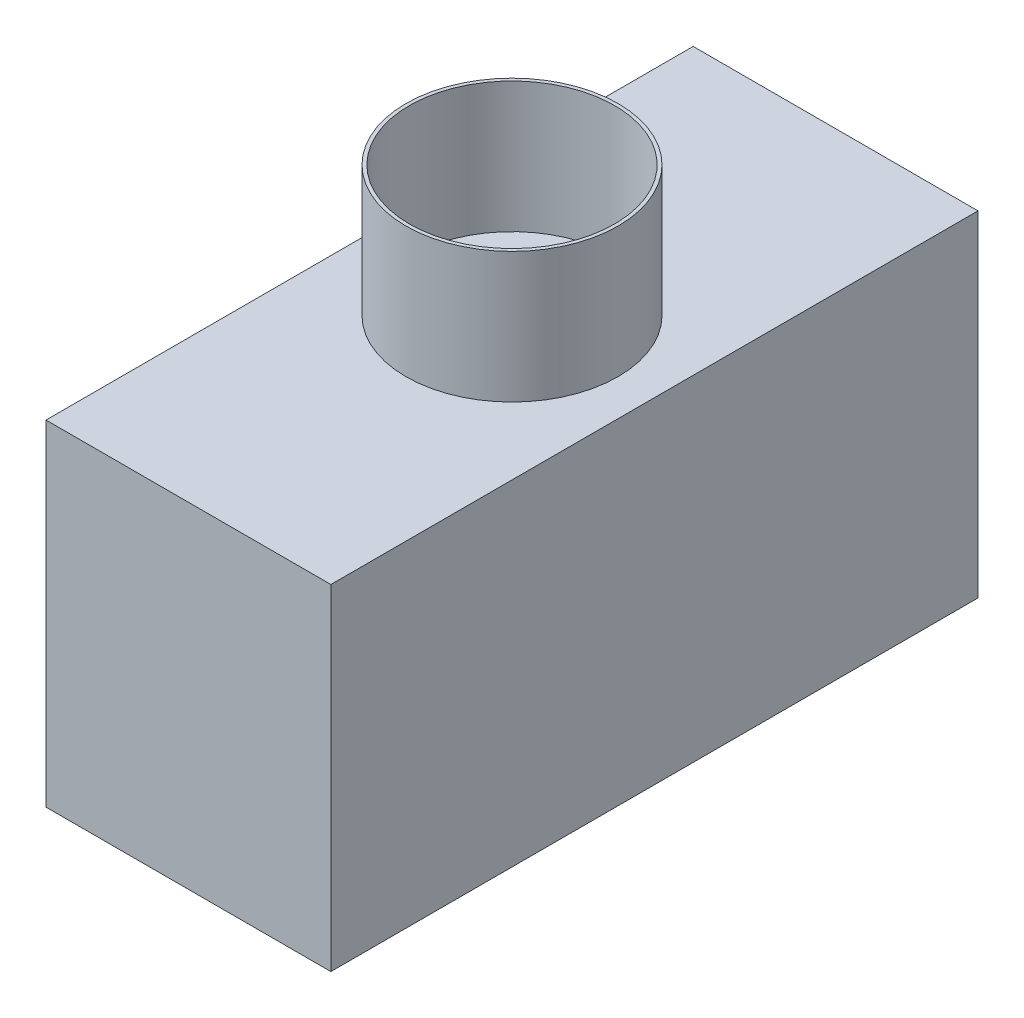
ISO-10303-21;
HEADER;
FILE_DESCRIPTION(('STEP AP214'),'2;1');
FILE_NAME('part.step','',(''),(''),'','','');
FILE_SCHEMA(('AUTOMOTIVE_DESIGN { 1 0 10303 214 1 1 1 1 }'));
ENDSEC;
DATA;
#1=APPLICATION_CONTEXT('core data for automotive mechanical design processes');
#2=APPLICATION_PROTOCOL_DEFINITION('international standard','automotive_design',2000,#1);
#3=PRODUCT_CONTEXT('',#1,'mechanical');
#4=PRODUCT('Part','Part','',(#3));
#5=PRODUCT_RELATED_PRODUCT_CATEGORY('part','',(#4));
#6=PRODUCT_DEFINITION_FORMATION('','',#4);
#7=PRODUCT_DEFINITION_CONTEXT('part definition',#1,'design');
#8=PRODUCT_DEFINITION('design','',#6,#7);
#9=PRODUCT_DEFINITION_SHAPE('','',#8);
#10=(LENGTH_UNIT() NAMED_UNIT(*) SI_UNIT(.MILLI.,.METRE.));
#11=(NAMED_UNIT(*) PLANE_ANGLE_UNIT() SI_UNIT($,.RADIAN.));
#12=(NAMED_UNIT(*) SI_UNIT($,.STERADIAN.) SOLID_ANGLE_UNIT());
#13=UNCERTAINTY_MEASURE_WITH_UNIT(LENGTH_MEASURE(1.E-05),#10,'distance_accuracy_value','');
#14=(GEOMETRIC_REPRESENTATION_CONTEXT(3) GLOBAL_UNCERTAINTY_ASSIGNED_CONTEXT((#13)) GLOBAL_UNIT_ASSIGNED_CONTEXT((#10,
#11,#12)) REPRESENTATION_CONTEXT('',''));
#15=CARTESIAN_POINT('',(0.,0.,0.));
#16=DIRECTION('',(0.,0.,1.));
#17=DIRECTION('',(1.,0.,0.));
#18=AXIS2_PLACEMENT_3D('',#15,#16,#17);
#19=CARTESIAN_POINT('',(0.,160.528,-309.88));
#20=DIRECTION('',(0.,-1.,0.));
#21=DIRECTION('',(0.,0.,-1.));
#22=AXIS2_PLACEMENT_3D('',#19,#20,#21);
#23=PLANE('',#22);
#24=DIRECTION('',(0.,0.,1.));
#25=VECTOR('',#24,1.);
#26=CARTESIAN_POINT('',(0.,160.528,0.));
#27=LINE('',#26,#25);
#28=CARTESIAN_POINT('',(0.,160.528,-309.88));
#29=VERTEX_POINT('',#28);
#30=CARTESIAN_POINT('',(0.,160.528,0.));
#31=VERTEX_POINT('',#30);
#32=EDGE_CURVE('E84',#29,#31,#27,.T.);
#33=ORIENTED_EDGE('',*,*,#32,.T.);
#34=DIRECTION('',(1.,0.,0.));
#35=VECTOR('',#34,1.);
#36=CARTESIAN_POINT('',(0.,160.528,0.));
#37=LINE('',#36,#35);
#38=CARTESIAN_POINT('',(136.398,160.528,0.));
#39=VERTEX_POINT('',#38);
#40=EDGE_CURVE('E79',#31,#39,#37,.T.);
#41=ORIENTED_EDGE('',*,*,#40,.T.);
#42=DIRECTION('',(0.,0.,-1.));
#43=VECTOR('',#42,1.);
#44=CARTESIAN_POINT('',(136.398,160.528,0.));
#45=LINE('',#44,#43);
#46=CARTESIAN_POINT('',(136.398,160.528,-309.88));
#47=VERTEX_POINT('',#46);
#48=EDGE_CURVE('E82',#39,#47,#45,.T.);
#49=ORIENTED_EDGE('',*,*,#48,.T.);
#50=DIRECTION('',(-1.,0.,0.));
#51=VECTOR('',#50,1.);
#52=CARTESIAN_POINT('',(0.,160.528,-309.88));
#53=LINE('',#52,#51);
#54=EDGE_CURVE('E48',#47,#29,#53,.T.);
#55=ORIENTED_EDGE('',*,*,#54,.T.);
#56=EDGE_LOOP('',(#33,#41,#49,#55));
#57=FACE_BOUND('',#56,.T.);
#58=CARTESIAN_POINT('',(68.199,160.528,-154.94));
#59=DIRECTION('',(0.,-1.,0.));
#60=DIRECTION('',(0.,0.,-1.));
#61=AXIS2_PLACEMENT_3D('',#58,#59,#60);
#62=CIRCLE('',#61,50.8);
#63=CARTESIAN_POINT('',(68.199,160.528,-205.74));
#64=VERTEX_POINT('',#63);
#65=EDGE_CURVE('E11',#64,#64,#62,.F.);
#66=ORIENTED_EDGE('',*,*,#65,.F.);
#67=EDGE_LOOP('',(#66));
#68=FACE_BOUND('',#67,.T.);
#69=ADVANCED_FACE('F30',(#57,#68),#23,.F.);
#70=CARTESIAN_POINT('',(0.,160.528,0.));
#71=DIRECTION('',(1.,0.,0.));
#72=DIRECTION('',(0.,0.,-1.));
#73=AXIS2_PLACEMENT_3D('',#70,#71,#72);
#74=PLANE('',#73);
#75=DIRECTION('',(0.,0.,1.));
#76=VECTOR('',#75,1.);
#77=CARTESIAN_POINT('',(0.,0.,0.));
#78=LINE('',#77,#76);
#79=CARTESIAN_POINT('',(0.,0.,-309.88));
#80=VERTEX_POINT('',#79);
#81=CARTESIAN_POINT('',(0.,0.,0.));
#82=VERTEX_POINT('',#81);
#83=EDGE_CURVE('E98',#80,#82,#78,.T.);
#84=ORIENTED_EDGE('',*,*,#83,.T.);
#85=DIRECTION('',(0.,-1.,0.));
#86=VECTOR('',#85,1.);
#87=CARTESIAN_POINT('',(0.,160.528,0.));
#88=LINE('',#87,#86);
#89=EDGE_CURVE('E40',#31,#82,#88,.T.);
#90=ORIENTED_EDGE('',*,*,#89,.F.);
#91=ORIENTED_EDGE('',*,*,#32,.F.);
#92=DIRECTION('',(0.,-1.,0.));
#93=VECTOR('',#92,1.);
#94=CARTESIAN_POINT('',(0.,160.528,-309.88));
#95=LINE('',#94,#93);
#96=EDGE_CURVE('E94',#29,#80,#95,.T.);
#97=ORIENTED_EDGE('',*,*,#96,.T.);
#98=EDGE_LOOP('',(#84,#90,#91,#97));
#99=FACE_BOUND('',#98,.T.);
#100=ADVANCED_FACE('F32',(#99),#74,.F.);
#101=CARTESIAN_POINT('',(0.,160.528,0.));
#102=DIRECTION('',(0.,0.,-1.));
#103=DIRECTION('',(-1.,0.,0.));
#104=AXIS2_PLACEMENT_3D('',#101,#102,#103);
#105=PLANE('',#104);
#106=DIRECTION('',(1.,0.,0.));
#107=VECTOR('',#106,1.);
#108=CARTESIAN_POINT('',(0.,0.,0.));
#109=LINE('',#108,#107);
#110=CARTESIAN_POINT('',(136.398,0.,0.));
#111=VERTEX_POINT('',#110);
#112=EDGE_CURVE('E89',#82,#111,#109,.T.);
#113=ORIENTED_EDGE('',*,*,#112,.T.);
#114=DIRECTION('',(0.,-1.,0.));
#115=VECTOR('',#114,1.);
#116=CARTESIAN_POINT('',(136.398,160.528,0.));
#117=LINE('',#116,#115);
#118=EDGE_CURVE('E87',#39,#111,#117,.T.);
#119=ORIENTED_EDGE('',*,*,#118,.F.);
#120=ORIENTED_EDGE('',*,*,#40,.F.);
#121=ORIENTED_EDGE('',*,*,#89,.T.);
#122=EDGE_LOOP('',(#113,#119,#120,#121));
#123=FACE_BOUND('',#122,.T.);
#124=ADVANCED_FACE('F88',(#123),#105,.F.);
#125=CARTESIAN_POINT('',(136.398,160.528,0.));
#126=DIRECTION('',(-1.,0.,0.));
#127=DIRECTION('',(0.,0.,1.));
#128=AXIS2_PLACEMENT_3D('',#125,#126,#127);
#129=PLANE('',#128);
#130=DIRECTION('',(0.,0.,-1.));
#131=VECTOR('',#130,1.);
#132=CARTESIAN_POINT('',(136.398,0.,0.));
#133=LINE('',#132,#131);
#134=CARTESIAN_POINT('',(136.398,0.,-309.88));
#135=VERTEX_POINT('',#134);
#136=EDGE_CURVE('E65',#111,#135,#133,.T.);
#137=ORIENTED_EDGE('',*,*,#136,.T.);
#138=DIRECTION('',(0.,-1.,0.));
#139=VECTOR('',#138,1.);
#140=CARTESIAN_POINT('',(136.398,160.528,-309.88));
#141=LINE('',#140,#139);
#142=EDGE_CURVE('E90',#47,#135,#141,.T.);
#143=ORIENTED_EDGE('',*,*,#142,.F.);
#144=ORIENTED_EDGE('',*,*,#48,.F.);
#145=ORIENTED_EDGE('',*,*,#118,.T.);
#146=EDGE_LOOP('',(#137,#143,#144,#145));
#147=FACE_BOUND('',#146,.T.);
#148=ADVANCED_FACE('F92',(#147),#129,.F.);
#149=CARTESIAN_POINT('',(0.,160.528,-309.88));
#150=DIRECTION('',(0.,0.,1.));
#151=DIRECTION('',(1.,0.,0.));
#152=AXIS2_PLACEMENT_3D('',#149,#150,#151);
#153=PLANE('',#152);
#154=DIRECTION('',(-1.,0.,0.));
#155=VECTOR('',#154,1.);
#156=CARTESIAN_POINT('',(0.,0.,-309.88));
#157=LINE('',#156,#155);
#158=EDGE_CURVE('E71',#135,#80,#157,.T.);
#159=ORIENTED_EDGE('',*,*,#158,.T.);
#160=ORIENTED_EDGE('',*,*,#96,.F.);
#161=ORIENTED_EDGE('',*,*,#54,.F.);
#162=ORIENTED_EDGE('',*,*,#142,.T.);
#163=EDGE_LOOP('',(#159,#160,#161,#162));
#164=FACE_BOUND('',#163,.T.);
#165=ADVANCED_FACE('F113',(#164),#153,.F.);
#166=CARTESIAN_POINT('',(0.,0.,-309.88));
#167=DIRECTION('',(0.,-1.,0.));
#168=DIRECTION('',(0.,0.,-1.));
#169=AXIS2_PLACEMENT_3D('',#166,#167,#168);
#170=PLANE('',#169);
#171=ORIENTED_EDGE('',*,*,#83,.F.);
#172=ORIENTED_EDGE('',*,*,#158,.F.);
#173=ORIENTED_EDGE('',*,*,#136,.F.);
#174=ORIENTED_EDGE('',*,*,#112,.F.);
#175=EDGE_LOOP('',(#171,#172,#173,#174));
#176=FACE_BOUND('',#175,.T.);
#177=ADVANCED_FACE('F110',(#176),#170,.T.);
#178=CARTESIAN_POINT('',(68.199,223.012,-154.94));
#179=DIRECTION('',(0.,-1.,0.));
#180=DIRECTION('',(0.,0.,-1.));
#181=AXIS2_PLACEMENT_3D('',#178,#179,#180);
#182=CYLINDRICAL_SURFACE('',#181,50.8);
#183=CARTESIAN_POINT('',(68.199,223.012,-154.94));
#184=DIRECTION('',(0.,1.,0.));
#185=DIRECTION('',(0.,0.,1.));
#186=AXIS2_PLACEMENT_3D('',#183,#184,#185);
#187=CIRCLE('',#186,50.8);
#188=CARTESIAN_POINT('',(68.199,223.012,-205.74));
#189=VERTEX_POINT('',#188);
#190=EDGE_CURVE('E101',#189,#189,#187,.T.);
#191=CARTESIAN_POINT('',(68.199,223.012,-205.74));
#192=CARTESIAN_POINT('',(68.199,222.361125,-205.74));
#193=CARTESIAN_POINT('',(68.199,221.71025,-205.74));
#194=CARTESIAN_POINT('',(68.199,220.4085,-205.74));
#195=CARTESIAN_POINT('',(68.199,219.757625,-205.74));
#196=CARTESIAN_POINT('',(68.199,218.455875,-205.74));
#197=CARTESIAN_POINT('',(68.199,217.805,-205.74));
#198=CARTESIAN_POINT('',(68.199,216.50325,-205.74));
#199=CARTESIAN_POINT('',(68.199,215.852375,-205.74));
#200=CARTESIAN_POINT('',(68.199,214.550625,-205.74));
#201=CARTESIAN_POINT('',(68.199,213.89975,-205.74));
#202=CARTESIAN_POINT('',(68.199,212.598,-205.74));
#203=CARTESIAN_POINT('',(68.199,211.947125,-205.74));
#204=CARTESIAN_POINT('',(68.199,210.645375,-205.74));
#205=CARTESIAN_POINT('',(68.199,209.9945,-205.74));
#206=CARTESIAN_POINT('',(68.199,208.69275,-205.74));
#207=CARTESIAN_POINT('',(68.199,208.041875,-205.74));
#208=CARTESIAN_POINT('',(68.199,206.740125,-205.74));
#209=CARTESIAN_POINT('',(68.199,206.08925,-205.74));
#210=CARTESIAN_POINT('',(68.199,204.7875,-205.74));
#211=CARTESIAN_POINT('',(68.199,204.136625,-205.74));
#212=CARTESIAN_POINT('',(68.199,202.834875,-205.74));
#213=CARTESIAN_POINT('',(68.199,202.184,-205.74));
#214=CARTESIAN_POINT('',(68.199,200.88225,-205.74));
#215=CARTESIAN_POINT('',(68.199,200.231375,-205.74));
#216=CARTESIAN_POINT('',(68.199,198.929625,-205.74));
#217=CARTESIAN_POINT('',(68.199,198.27875,-205.74));
#218=CARTESIAN_POINT('',(68.199,196.977,-205.74));
#219=CARTESIAN_POINT('',(68.199,196.326125,-205.74));
#220=CARTESIAN_POINT('',(68.199,195.024375,-205.74));
#221=CARTESIAN_POINT('',(68.199,194.3735,-205.74));
#222=CARTESIAN_POINT('',(68.199,193.07175,-205.74));
#223=CARTESIAN_POINT('',(68.199,192.420875,-205.74));
#224=CARTESIAN_POINT('',(68.199,191.119125,-205.74));
#225=CARTESIAN_POINT('',(68.199,190.46825,-205.74));
#226=CARTESIAN_POINT('',(68.199,189.1665,-205.74));
#227=CARTESIAN_POINT('',(68.199,188.515625,-205.74));
#228=CARTESIAN_POINT('',(68.199,187.213875,-205.74));
#229=CARTESIAN_POINT('',(68.199,186.563,-205.74));
#230=CARTESIAN_POINT('',(68.199,185.26125,-205.74));
#231=CARTESIAN_POINT('',(68.199,184.610375,-205.74));
#232=CARTESIAN_POINT('',(68.199,183.308625,-205.74));
#233=CARTESIAN_POINT('',(68.199,182.65775,-205.74));
#234=CARTESIAN_POINT('',(68.199,181.356,-205.74));
#235=CARTESIAN_POINT('',(68.199,180.705125,-205.74));
#236=CARTESIAN_POINT('',(68.199,179.403375,-205.74));
#237=CARTESIAN_POINT('',(68.199,178.7525,-205.74));
#238=CARTESIAN_POINT('',(68.199,177.45075,-205.74));
#239=CARTESIAN_POINT('',(68.199,176.799875,-205.74));
#240=CARTESIAN_POINT('',(68.199,175.498125,-205.74));
#241=CARTESIAN_POINT('',(68.199,174.84725,-205.74));
#242=CARTESIAN_POINT('',(68.199,173.5455,-205.74));
#243=CARTESIAN_POINT('',(68.199,172.894625,-205.74));
#244=CARTESIAN_POINT('',(68.199,171.592875,-205.74));
#245=CARTESIAN_POINT('',(68.199,170.942,-205.74));
#246=CARTESIAN_POINT('',(68.199,169.64025,-205.74));
#247=CARTESIAN_POINT('',(68.199,168.989375,-205.74));
#248=CARTESIAN_POINT('',(68.199,167.687625,-205.74));
#249=CARTESIAN_POINT('',(68.199,167.03675,-205.74));
#250=CARTESIAN_POINT('',(68.199,165.735,-205.74));
#251=CARTESIAN_POINT('',(68.199,165.084125,-205.74));
#252=CARTESIAN_POINT('',(68.199,163.782375,-205.74));
#253=CARTESIAN_POINT('',(68.199,163.1315,-205.74));
#254=CARTESIAN_POINT('',(68.199,161.82975,-205.74));
#255=CARTESIAN_POINT('',(68.199,161.178875,-205.74));
#256=CARTESIAN_POINT('',(68.199,160.528,-205.74));
#257=B_SPLINE_CURVE_WITH_KNOTS('',3,(#191,#192,#193,#194,#195,#196,#197,#198,#199,#200,#201,
#202,#203,#204,#205,#206,#207,#208,#209,#210,#211,#212,#213,#214,#215,#216,#217,#218,#219,#220,
#221,#222,#223,#224,#225,#226,#227,#228,#229,#230,#231,#232,#233,#234,#235,#236,#237,#238,#239,
#240,#241,#242,#243,#244,#245,#246,#247,#248,#249,#250,#251,#252,#253,#254,#255,#256),
.UNSPECIFIED.,.F.,.F.,(4,2,2,2,2,2,2,2,2,2,2,2,2,2,2,2,2,2,2,2,2,2,2,2,2,2,2,2,2,2,2,2,4),(0.,
1.95262499999999,3.90524999999997,5.85787499999998,7.81049999999997,9.76312499999998,11.71575,
13.668375,15.621,17.573625,19.52625,21.478875,23.4315,25.384125,27.33675,29.2893749999999,
31.242,33.194625,35.14725,37.0998749999999,39.0525,41.0051249999999,42.9577499999999,
44.9103749999999,46.863,48.8156249999999,50.7682499999999,52.7208749999999,54.6734999999999,
56.6261249999999,58.5787499999999,60.5313749999999,62.4839999999999),.UNSPECIFIED.);
#258=EDGE_CURVE('BSEAM112',#189,#64,#257,.T.);
#259=ORIENTED_EDGE('',*,*,#190,.F.);
#260=ORIENTED_EDGE('',*,*,#65,.T.);
#261=ORIENTED_EDGE('',*,*,#258,.T.);
#262=ORIENTED_EDGE('',*,*,#258,.F.);
#263=EDGE_LOOP('',(#259,#261,#260,#262));
#264=FACE_BOUND('',#263,.T.);
#265=ADVANCED_FACE('F112',(#264),#182,.T.);
#266=CARTESIAN_POINT('',(68.199,223.012,-154.94));
#267=DIRECTION('',(0.,1.,0.));
#268=DIRECTION('',(0.,0.,1.));
#269=AXIS2_PLACEMENT_3D('',#266,#267,#268);
#270=PLANE('',#269);
#271=CARTESIAN_POINT('',(68.199,223.012,-154.94));
#272=DIRECTION('',(0.,1.,0.));
#273=DIRECTION('',(0.,0.,1.));
#274=AXIS2_PLACEMENT_3D('',#271,#272,#273);
#275=CIRCLE('',#274,49.149);
#276=CARTESIAN_POINT('',(68.199,223.012,-105.791));
#277=VERTEX_POINT('',#276);
#278=EDGE_CURVE('E34',#277,#277,#275,.T.);
#279=ORIENTED_EDGE('',*,*,#278,.F.);
#280=EDGE_LOOP('',(#279));
#281=FACE_BOUND('',#280,.T.);
#282=ORIENTED_EDGE('',*,*,#190,.T.);
#283=EDGE_LOOP('',(#282));
#284=FACE_BOUND('',#283,.T.);
#285=ADVANCED_FACE('F119',(#281,#284),#270,.T.);
#286=CARTESIAN_POINT('',(68.199,160.528,-154.94));
#287=DIRECTION('',(0.,1.,0.));
#288=DIRECTION('',(0.,0.,1.));
#289=AXIS2_PLACEMENT_3D('',#286,#287,#288);
#290=CYLINDRICAL_SURFACE('',#289,49.149);
#291=CARTESIAN_POINT('',(68.199,160.528,-154.94));
#292=DIRECTION('',(0.,1.,0.));
#293=DIRECTION('',(0.,0.,1.));
#294=AXIS2_PLACEMENT_3D('',#291,#292,#293);
#295=CIRCLE('',#294,49.149);
#296=CARTESIAN_POINT('',(68.199,160.528,-105.791));
#297=VERTEX_POINT('',#296);
#298=EDGE_CURVE('E143',#297,#297,#295,.T.);
#299=CARTESIAN_POINT('',(68.199,223.012,-105.791));
#300=CARTESIAN_POINT('',(68.199,222.361125,-105.791));
#301=CARTESIAN_POINT('',(68.199,221.71025,-105.791));
#302=CARTESIAN_POINT('',(68.199,220.4085,-105.791));
#303=CARTESIAN_POINT('',(68.199,219.757625,-105.791));
#304=CARTESIAN_POINT('',(68.199,218.455875,-105.791));
#305=CARTESIAN_POINT('',(68.199,217.805,-105.791));
#306=CARTESIAN_POINT('',(68.199,216.50325,-105.791));
#307=CARTESIAN_POINT('',(68.199,215.852375,-105.791));
#308=CARTESIAN_POINT('',(68.199,214.550625,-105.791));
#309=CARTESIAN_POINT('',(68.199,213.89975,-105.791));
#310=CARTESIAN_POINT('',(68.199,212.598,-105.791));
#311=CARTESIAN_POINT('',(68.199,211.947125,-105.791));
#312=CARTESIAN_POINT('',(68.199,210.645375,-105.791));
#313=CARTESIAN_POINT('',(68.199,209.9945,-105.791));
#314=CARTESIAN_POINT('',(68.199,208.69275,-105.791));
#315=CARTESIAN_POINT('',(68.199,208.041875,-105.791));
#316=CARTESIAN_POINT('',(68.199,206.740125,-105.791));
#317=CARTESIAN_POINT('',(68.199,206.08925,-105.791));
#318=CARTESIAN_POINT('',(68.199,204.7875,-105.791));
#319=CARTESIAN_POINT('',(68.199,204.136625,-105.791));
#320=CARTESIAN_POINT('',(68.199,202.834875,-105.791));
#321=CARTESIAN_POINT('',(68.199,202.184,-105.791));
#322=CARTESIAN_POINT('',(68.199,200.88225,-105.791));
#323=CARTESIAN_POINT('',(68.199,200.231375,-105.791));
#324=CARTESIAN_POINT('',(68.199,198.929625,-105.791));
#325=CARTESIAN_POINT('',(68.199,198.27875,-105.791));
#326=CARTESIAN_POINT('',(68.199,196.977,-105.791));
#327=CARTESIAN_POINT('',(68.199,196.326125,-105.791));
#328=CARTESIAN_POINT('',(68.199,195.024375,-105.791));
#329=CARTESIAN_POINT('',(68.199,194.3735,-105.791));
#330=CARTESIAN_POINT('',(68.199,193.07175,-105.791));
#331=CARTESIAN_POINT('',(68.199,192.420875,-105.791));
#332=CARTESIAN_POINT('',(68.199,191.119125,-105.791));
#333=CARTESIAN_POINT('',(68.199,190.46825,-105.791));
#334=CARTESIAN_POINT('',(68.199,189.1665,-105.791));
#335=CARTESIAN_POINT('',(68.199,188.515625,-105.791));
#336=CARTESIAN_POINT('',(68.199,187.213875,-105.791));
#337=CARTESIAN_POINT('',(68.199,186.563,-105.791));
#338=CARTESIAN_POINT('',(68.199,185.26125,-105.791));
#339=CARTESIAN_POINT('',(68.199,184.610375,-105.791));
#340=CARTESIAN_POINT('',(68.199,183.308625,-105.791));
#341=CARTESIAN_POINT('',(68.199,182.65775,-105.791));
#342=CARTESIAN_POINT('',(68.199,181.356,-105.791));
#343=CARTESIAN_POINT('',(68.199,180.705125,-105.791));
#344=CARTESIAN_POINT('',(68.199,179.403375,-105.791));
#345=CARTESIAN_POINT('',(68.199,178.7525,-105.791));
#346=CARTESIAN_POINT('',(68.199,177.45075,-105.791));
#347=CARTESIAN_POINT('',(68.199,176.799875,-105.791));
#348=CARTESIAN_POINT('',(68.199,175.498125,-105.791));
#349=CARTESIAN_POINT('',(68.199,174.84725,-105.791));
#350=CARTESIAN_POINT('',(68.199,173.5455,-105.791));
#351=CARTESIAN_POINT('',(68.199,172.894625,-105.791));
#352=CARTESIAN_POINT('',(68.199,171.592875,-105.791));
#353=CARTESIAN_POINT('',(68.199,170.942,-105.791));
#354=CARTESIAN_POINT('',(68.199,169.64025,-105.791));
#355=CARTESIAN_POINT('',(68.199,168.989375,-105.791));
#356=CARTESIAN_POINT('',(68.199,167.687625,-105.791));
#357=CARTESIAN_POINT('',(68.199,167.03675,-105.791));
#358=CARTESIAN_POINT('',(68.199,165.735,-105.791));
#359=CARTESIAN_POINT('',(68.199,165.084125,-105.791));
#360=CARTESIAN_POINT('',(68.199,163.782375,-105.791));
#361=CARTESIAN_POINT('',(68.199,163.1315,-105.791));
#362=CARTESIAN_POINT('',(68.199,161.82975,-105.791));
#363=CARTESIAN_POINT('',(68.199,161.178875,-105.791));
#364=CARTESIAN_POINT('',(68.199,160.528,-105.791));
#365=B_SPLINE_CURVE_WITH_KNOTS('',3,(#299,#300,#301,#302,#303,#304,#305,#306,#307,#308,#309,
#310,#311,#312,#313,#314,#315,#316,#317,#318,#319,#320,#321,#322,#323,#324,#325,#326,#327,#328,
#329,#330,#331,#332,#333,#334,#335,#336,#337,#338,#339,#340,#341,#342,#343,#344,#345,#346,#347,
#348,#349,#350,#351,#352,#353,#354,#355,#356,#357,#358,#359,#360,#361,#362,#363,#364),
.UNSPECIFIED.,.F.,.F.,(4,2,2,2,2,2,2,2,2,2,2,2,2,2,2,2,2,2,2,2,2,2,2,2,2,2,2,2,2,2,2,2,4),(0.,
1.95262499999999,3.90525,5.85787499999998,7.8105,9.76312499999998,11.71575,13.668375,15.621,
17.573625,19.52625,21.478875,23.4315,25.384125,27.33675,29.289375,31.242,33.194625,35.14725,
37.099875,39.0525,41.005125,42.95775,44.910375,46.863,48.815625,50.76825,52.720875,54.6735,
56.626125,58.57875,60.531375,62.484),.UNSPECIFIED.);
#366=EDGE_CURVE('BSEAM131',#277,#297,#365,.T.);
#367=ORIENTED_EDGE('',*,*,#278,.T.);
#368=ORIENTED_EDGE('',*,*,#298,.F.);
#369=ORIENTED_EDGE('',*,*,#366,.T.);
#370=ORIENTED_EDGE('',*,*,#366,.F.);
#371=EDGE_LOOP('',(#367,#369,#368,#370));
#372=FACE_BOUND('',#371,.T.);
#373=ADVANCED_FACE('F131',(#372),#290,.F.);
#374=CARTESIAN_POINT('',(68.199,160.528,-154.94));
#375=DIRECTION('',(0.,1.,0.));
#376=DIRECTION('',(0.,0.,1.));
#377=AXIS2_PLACEMENT_3D('',#374,#375,#376);
#378=PLANE('',#377);
#379=ORIENTED_EDGE('',*,*,#298,.T.);
#380=EDGE_LOOP('',(#379));
#381=FACE_BOUND('',#380,.T.);
#382=ADVANCED_FACE('F135',(#381),#378,.T.);
#383=CLOSED_SHELL('',(#69,#100,#124,#148,#165,#177,#265,#285,#373,#382));
#384=MANIFOLD_SOLID_BREP('B2',#383);
#385=ADVANCED_BREP_SHAPE_REPRESENTATION('',(#18,#384),#14);
#386=SHAPE_DEFINITION_REPRESENTATION(#9,#385);
ENDSEC;
END-ISO-10303-21;
